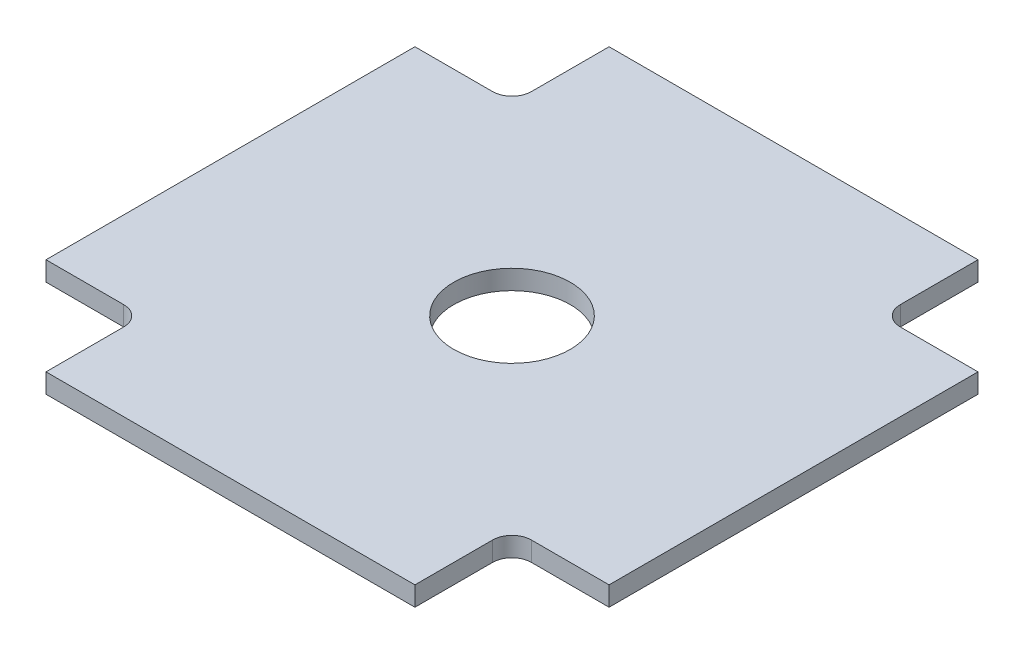
ISO-10303-21;
HEADER;
FILE_DESCRIPTION(('STEP AP214'),'2;1');
FILE_NAME('part.step','',(''),(''),'','','');
FILE_SCHEMA(('AUTOMOTIVE_DESIGN { 1 0 10303 214 1 1 1 1 }'));
ENDSEC;
DATA;
#1=APPLICATION_CONTEXT('core data for automotive mechanical design processes');
#2=APPLICATION_PROTOCOL_DEFINITION('international standard','automotive_design',2000,#1);
#3=PRODUCT_CONTEXT('',#1,'mechanical');
#4=PRODUCT('Part','Part','',(#3));
#5=PRODUCT_RELATED_PRODUCT_CATEGORY('part','',(#4));
#6=PRODUCT_DEFINITION_FORMATION('','',#4);
#7=PRODUCT_DEFINITION_CONTEXT('part definition',#1,'design');
#8=PRODUCT_DEFINITION('design','',#6,#7);
#9=PRODUCT_DEFINITION_SHAPE('','',#8);
#10=(LENGTH_UNIT() NAMED_UNIT(*) SI_UNIT(.MILLI.,.METRE.));
#11=(NAMED_UNIT(*) PLANE_ANGLE_UNIT() SI_UNIT($,.RADIAN.));
#12=(NAMED_UNIT(*) SI_UNIT($,.STERADIAN.) SOLID_ANGLE_UNIT());
#13=UNCERTAINTY_MEASURE_WITH_UNIT(LENGTH_MEASURE(1.E-05),#10,'distance_accuracy_value','');
#14=(GEOMETRIC_REPRESENTATION_CONTEXT(3) GLOBAL_UNCERTAINTY_ASSIGNED_CONTEXT((#13)) GLOBAL_UNIT_ASSIGNED_CONTEXT((#10,
#11,#12)) REPRESENTATION_CONTEXT('',''));
#15=CARTESIAN_POINT('',(0.,0.,0.));
#16=DIRECTION('',(0.,0.,1.));
#17=DIRECTION('',(1.,0.,0.));
#18=AXIS2_PLACEMENT_3D('',#15,#16,#17);
#19=CARTESIAN_POINT('',(0.,1.,0.));
#20=DIRECTION('',(0.,-1.,0.));
#21=DIRECTION('',(0.,0.,-1.));
#22=AXIS2_PLACEMENT_3D('',#19,#20,#21);
#23=PLANE('',#22);
#24=DIRECTION('',(0.,0.,1.));
#25=VECTOR('',#24,1.);
#26=CARTESIAN_POINT('',(0.,1.,-24.));
#27=LINE('',#26,#25);
#28=CARTESIAN_POINT('',(0.,1.,-24.));
#29=VERTEX_POINT('',#28);
#30=CARTESIAN_POINT('',(1.66533453693773E-13,1.,-5.00000000000015));
#31=VERTEX_POINT('',#30);
#32=EDGE_CURVE('E171',#29,#31,#27,.T.);
#33=ORIENTED_EDGE('',*,*,#32,.T.);
#34=DIRECTION('',(1.,0.,0.));
#35=VECTOR('',#34,1.);
#36=CARTESIAN_POINT('',(5.00000000000017,1.,-5.0000000000001));
#37=LINE('',#36,#35);
#38=CARTESIAN_POINT('',(4.00000000000019,1.,-5.00000000000011));
#39=VERTEX_POINT('',#38);
#40=EDGE_CURVE('E161',#31,#39,#37,.T.);
#41=ORIENTED_EDGE('',*,*,#40,.T.);
#42=CARTESIAN_POINT('',(4.00000000000018,1.,-4.00000000000011));
#43=DIRECTION('',(0.,-1.,0.));
#44=DIRECTION('',(0.,0.,-1.));
#45=AXIS2_PLACEMENT_3D('',#42,#43,#44);
#46=CIRCLE('',#45,1.);
#47=CARTESIAN_POINT('',(5.00000000000018,1.,-4.00000000000012));
#48=VERTEX_POINT('',#47);
#49=EDGE_CURVE('E11',#39,#48,#46,.T.);
#50=ORIENTED_EDGE('',*,*,#49,.T.);
#51=DIRECTION('',(0.,0.,1.));
#52=VECTOR('',#51,1.);
#53=CARTESIAN_POINT('',(5.00000000000023,1.,-4.1365962923348E-13));
#54=LINE('',#53,#52);
#55=CARTESIAN_POINT('',(5.00000000000023,1.,-4.1365962923348E-13));
#56=VERTEX_POINT('',#55);
#57=EDGE_CURVE('E170',#48,#56,#54,.T.);
#58=ORIENTED_EDGE('',*,*,#57,.T.);
#59=DIRECTION('',(1.,0.,0.));
#60=VECTOR('',#59,1.);
#61=CARTESIAN_POINT('',(5.00000000000023,1.,-4.1365962923348E-13));
#62=LINE('',#61,#60);
#63=CARTESIAN_POINT('',(24.0000000000002,1.,-1.97758476261356E-13));
#64=VERTEX_POINT('',#63);
#65=EDGE_CURVE('E356',#56,#64,#62,.T.);
#66=ORIENTED_EDGE('',*,*,#65,.T.);
#67=DIRECTION('',(0.,0.,-1.));
#68=VECTOR('',#67,1.);
#69=CARTESIAN_POINT('',(24.0000000000002,1.,-5.0000000000002));
#70=LINE('',#69,#68);
#71=CARTESIAN_POINT('',(24.0000000000002,1.,-4.0000000000002));
#72=VERTEX_POINT('',#71);
#73=EDGE_CURVE('E301',#64,#72,#70,.T.);
#74=ORIENTED_EDGE('',*,*,#73,.T.);
#75=CARTESIAN_POINT('',(25.0000000000002,1.,-4.00000000000019));
#76=DIRECTION('',(0.,-1.,0.));
#77=DIRECTION('',(0.,0.,-1.));
#78=AXIS2_PLACEMENT_3D('',#75,#76,#77);
#79=CIRCLE('',#78,1.);
#80=CARTESIAN_POINT('',(25.0000000000002,1.,-5.00000000000019));
#81=VERTEX_POINT('',#80);
#82=EDGE_CURVE('E225',#72,#81,#79,.T.);
#83=ORIENTED_EDGE('',*,*,#82,.T.);
#84=DIRECTION('',(1.,0.,0.));
#85=VECTOR('',#84,1.);
#86=CARTESIAN_POINT('',(29.0000000000002,1.,-5.00000000000016));
#87=LINE('',#86,#85);
#88=CARTESIAN_POINT('',(29.0000000000002,1.,-5.00000000000016));
#89=VERTEX_POINT('',#88);
#90=EDGE_CURVE('E361',#81,#89,#87,.T.);
#91=ORIENTED_EDGE('',*,*,#90,.T.);
#92=DIRECTION('',(0.,0.,-1.));
#93=VECTOR('',#92,1.);
#94=CARTESIAN_POINT('',(29.,1.,-24.0000000000002));
#95=LINE('',#94,#93);
#96=CARTESIAN_POINT('',(29.,1.,-24.0000000000002));
#97=VERTEX_POINT('',#96);
#98=EDGE_CURVE('E367',#89,#97,#95,.T.);
#99=ORIENTED_EDGE('',*,*,#98,.T.);
#100=DIRECTION('',(-1.,0.,0.));
#101=VECTOR('',#100,1.);
#102=CARTESIAN_POINT('',(24.,1.,-24.0000000000002));
#103=LINE('',#102,#101);
#104=CARTESIAN_POINT('',(25.,1.,-24.0000000000002));
#105=VERTEX_POINT('',#104);
#106=EDGE_CURVE('E340',#97,#105,#103,.T.);
#107=ORIENTED_EDGE('',*,*,#106,.T.);
#108=CARTESIAN_POINT('',(25.,1.,-25.0000000000002));
#109=DIRECTION('',(0.,-1.,0.));
#110=DIRECTION('',(0.,0.,-1.));
#111=AXIS2_PLACEMENT_3D('',#108,#109,#110);
#112=CIRCLE('',#111,1.);
#113=CARTESIAN_POINT('',(24.,1.,-25.0000000000002));
#114=VERTEX_POINT('',#113);
#115=EDGE_CURVE('E231',#105,#114,#112,.T.);
#116=ORIENTED_EDGE('',*,*,#115,.T.);
#117=DIRECTION('',(0.,0.,-1.));
#118=VECTOR('',#117,1.);
#119=CARTESIAN_POINT('',(24.0000000000001,1.,-29.0000000000002));
#120=LINE('',#119,#118);
#121=CARTESIAN_POINT('',(24.0000000000001,1.,-29.0000000000002));
#122=VERTEX_POINT('',#121);
#123=EDGE_CURVE('E335',#114,#122,#120,.T.);
#124=ORIENTED_EDGE('',*,*,#123,.T.);
#125=DIRECTION('',(-1.,0.,0.));
#126=VECTOR('',#125,1.);
#127=CARTESIAN_POINT('',(5.,1.,-29.));
#128=LINE('',#127,#126);
#129=CARTESIAN_POINT('',(5.,1.,-29.));
#130=VERTEX_POINT('',#129);
#131=EDGE_CURVE('E333',#122,#130,#128,.T.);
#132=ORIENTED_EDGE('',*,*,#131,.T.);
#133=DIRECTION('',(0.,0.,1.));
#134=VECTOR('',#133,1.);
#135=CARTESIAN_POINT('',(5.,1.,-24.));
#136=LINE('',#135,#134);
#137=CARTESIAN_POINT('',(5.,1.,-25.));
#138=VERTEX_POINT('',#137);
#139=EDGE_CURVE('E243',#130,#138,#136,.T.);
#140=ORIENTED_EDGE('',*,*,#139,.T.);
#141=CARTESIAN_POINT('',(4.,1.,-25.));
#142=DIRECTION('',(0.,-1.,0.));
#143=DIRECTION('',(0.,0.,-1.));
#144=AXIS2_PLACEMENT_3D('',#141,#142,#143);
#145=CIRCLE('',#144,1.);
#146=CARTESIAN_POINT('',(4.,1.,-24.));
#147=VERTEX_POINT('',#146);
#148=EDGE_CURVE('E237',#138,#147,#145,.T.);
#149=ORIENTED_EDGE('',*,*,#148,.T.);
#150=DIRECTION('',(-1.,0.,0.));
#151=VECTOR('',#150,1.);
#152=CARTESIAN_POINT('',(0.,1.,-24.));
#153=LINE('',#152,#151);
#154=EDGE_CURVE('E176',#147,#29,#153,.T.);
#155=ORIENTED_EDGE('',*,*,#154,.T.);
#156=EDGE_LOOP('',(#33,#41,#50,#58,#66,#74,#83,#91,#99,#107,#116,#124,#132,#140,#149,#155));
#157=FACE_BOUND('',#156,.T.);
#158=CARTESIAN_POINT('',(14.5,1.,-14.5));
#159=DIRECTION('',(0.,1.,0.));
#160=DIRECTION('',(0.,0.,1.));
#161=AXIS2_PLACEMENT_3D('',#158,#159,#160);
#162=CIRCLE('',#161,3.);
#163=CARTESIAN_POINT('',(14.5,1.,-11.5));
#164=VERTEX_POINT('',#163);
#165=EDGE_CURVE('E347',#164,#164,#162,.T.);
#166=ORIENTED_EDGE('',*,*,#165,.F.);
#167=EDGE_LOOP('',(#166));
#168=FACE_BOUND('',#167,.T.);
#169=ADVANCED_FACE('F51',(#157,#168),#23,.F.);
#170=CARTESIAN_POINT('',(0.,0.,0.));
#171=DIRECTION('',(0.,-1.,0.));
#172=DIRECTION('',(0.,0.,-1.));
#173=AXIS2_PLACEMENT_3D('',#170,#171,#172);
#174=PLANE('',#173);
#175=DIRECTION('',(0.,0.,1.));
#176=VECTOR('',#175,1.);
#177=CARTESIAN_POINT('',(0.,0.,-24.));
#178=LINE('',#177,#176);
#179=CARTESIAN_POINT('',(0.,0.,-24.));
#180=VERTEX_POINT('',#179);
#181=CARTESIAN_POINT('',(1.66533453693773E-13,0.,-5.00000000000015));
#182=VERTEX_POINT('',#181);
#183=EDGE_CURVE('E185',#180,#182,#178,.T.);
#184=ORIENTED_EDGE('',*,*,#183,.F.);
#185=DIRECTION('',(-1.,0.,0.));
#186=VECTOR('',#185,1.);
#187=CARTESIAN_POINT('',(0.,0.,-24.));
#188=LINE('',#187,#186);
#189=CARTESIAN_POINT('',(4.,0.,-24.));
#190=VERTEX_POINT('',#189);
#191=EDGE_CURVE('E181',#190,#180,#188,.T.);
#192=ORIENTED_EDGE('',*,*,#191,.F.);
#193=CARTESIAN_POINT('',(4.,0.,-25.));
#194=DIRECTION('',(0.,-1.,0.));
#195=DIRECTION('',(0.,0.,-1.));
#196=AXIS2_PLACEMENT_3D('',#193,#194,#195);
#197=CIRCLE('',#196,1.);
#198=CARTESIAN_POINT('',(5.,0.,-25.));
#199=VERTEX_POINT('',#198);
#200=EDGE_CURVE('E234',#190,#199,#197,.F.);
#201=ORIENTED_EDGE('',*,*,#200,.T.);
#202=DIRECTION('',(0.,0.,1.));
#203=VECTOR('',#202,1.);
#204=CARTESIAN_POINT('',(5.,0.,-24.));
#205=LINE('',#204,#203);
#206=CARTESIAN_POINT('',(5.,0.,-29.));
#207=VERTEX_POINT('',#206);
#208=EDGE_CURVE('E259',#207,#199,#205,.T.);
#209=ORIENTED_EDGE('',*,*,#208,.F.);
#210=DIRECTION('',(-1.,0.,0.));
#211=VECTOR('',#210,1.);
#212=CARTESIAN_POINT('',(5.,0.,-29.));
#213=LINE('',#212,#211);
#214=CARTESIAN_POINT('',(24.0000000000001,0.,-29.0000000000002));
#215=VERTEX_POINT('',#214);
#216=EDGE_CURVE('E266',#215,#207,#213,.T.);
#217=ORIENTED_EDGE('',*,*,#216,.F.);
#218=DIRECTION('',(0.,0.,-1.));
#219=VECTOR('',#218,1.);
#220=CARTESIAN_POINT('',(24.0000000000001,0.,-29.0000000000002));
#221=LINE('',#220,#219);
#222=CARTESIAN_POINT('',(24.,0.,-25.0000000000002));
#223=VERTEX_POINT('',#222);
#224=EDGE_CURVE('E271',#223,#215,#221,.T.);
#225=ORIENTED_EDGE('',*,*,#224,.F.);
#226=CARTESIAN_POINT('',(25.,0.,-25.0000000000002));
#227=DIRECTION('',(0.,-1.,0.));
#228=DIRECTION('',(0.,0.,-1.));
#229=AXIS2_PLACEMENT_3D('',#226,#227,#228);
#230=CIRCLE('',#229,1.);
#231=CARTESIAN_POINT('',(25.,0.,-24.0000000000002));
#232=VERTEX_POINT('',#231);
#233=EDGE_CURVE('E228',#223,#232,#230,.F.);
#234=ORIENTED_EDGE('',*,*,#233,.T.);
#235=DIRECTION('',(-1.,0.,0.));
#236=VECTOR('',#235,1.);
#237=CARTESIAN_POINT('',(24.,0.,-24.0000000000002));
#238=LINE('',#237,#236);
#239=CARTESIAN_POINT('',(29.,0.,-24.0000000000002));
#240=VERTEX_POINT('',#239);
#241=EDGE_CURVE('E320',#240,#232,#238,.T.);
#242=ORIENTED_EDGE('',*,*,#241,.F.);
#243=DIRECTION('',(0.,0.,-1.));
#244=VECTOR('',#243,1.);
#245=CARTESIAN_POINT('',(29.,0.,-24.0000000000002));
#246=LINE('',#245,#244);
#247=CARTESIAN_POINT('',(29.0000000000002,0.,-5.00000000000016));
#248=VERTEX_POINT('',#247);
#249=EDGE_CURVE('E312',#248,#240,#246,.T.);
#250=ORIENTED_EDGE('',*,*,#249,.F.);
#251=DIRECTION('',(1.,0.,0.));
#252=VECTOR('',#251,1.);
#253=CARTESIAN_POINT('',(29.0000000000002,0.,-5.00000000000016));
#254=LINE('',#253,#252);
#255=CARTESIAN_POINT('',(25.0000000000002,0.,-5.00000000000019));
#256=VERTEX_POINT('',#255);
#257=EDGE_CURVE('E308',#256,#248,#254,.T.);
#258=ORIENTED_EDGE('',*,*,#257,.F.);
#259=CARTESIAN_POINT('',(25.0000000000002,0.,-4.00000000000019));
#260=DIRECTION('',(0.,-1.,0.));
#261=DIRECTION('',(0.,0.,-1.));
#262=AXIS2_PLACEMENT_3D('',#259,#260,#261);
#263=CIRCLE('',#262,1.);
#264=CARTESIAN_POINT('',(24.0000000000002,0.,-4.0000000000002));
#265=VERTEX_POINT('',#264);
#266=EDGE_CURVE('E222',#256,#265,#263,.F.);
#267=ORIENTED_EDGE('',*,*,#266,.T.);
#268=DIRECTION('',(0.,0.,-1.));
#269=VECTOR('',#268,1.);
#270=CARTESIAN_POINT('',(24.0000000000002,0.,-5.0000000000002));
#271=LINE('',#270,#269);
#272=CARTESIAN_POINT('',(24.0000000000002,0.,-1.97758476261356E-13));
#273=VERTEX_POINT('',#272);
#274=EDGE_CURVE('E298',#273,#265,#271,.T.);
#275=ORIENTED_EDGE('',*,*,#274,.F.);
#276=DIRECTION('',(1.,0.,0.));
#277=VECTOR('',#276,1.);
#278=CARTESIAN_POINT('',(5.00000000000023,0.,-4.1365962923348E-13));
#279=LINE('',#278,#277);
#280=CARTESIAN_POINT('',(5.00000000000023,0.,-4.1365962923348E-13));
#281=VERTEX_POINT('',#280);
#282=EDGE_CURVE('E305',#281,#273,#279,.T.);
#283=ORIENTED_EDGE('',*,*,#282,.F.);
#284=DIRECTION('',(0.,0.,1.));
#285=VECTOR('',#284,1.);
#286=CARTESIAN_POINT('',(5.00000000000023,0.,-4.1365962923348E-13));
#287=LINE('',#286,#285);
#288=CARTESIAN_POINT('',(5.00000000000018,0.,-4.00000000000012));
#289=VERTEX_POINT('',#288);
#290=EDGE_CURVE('E314',#289,#281,#287,.T.);
#291=ORIENTED_EDGE('',*,*,#290,.F.);
#292=CARTESIAN_POINT('',(4.00000000000018,0.,-4.00000000000011));
#293=DIRECTION('',(0.,-1.,0.));
#294=DIRECTION('',(0.,0.,-1.));
#295=AXIS2_PLACEMENT_3D('',#292,#293,#294);
#296=CIRCLE('',#295,1.);
#297=CARTESIAN_POINT('',(4.00000000000019,0.,-5.00000000000011));
#298=VERTEX_POINT('',#297);
#299=EDGE_CURVE('E60',#289,#298,#296,.F.);
#300=ORIENTED_EDGE('',*,*,#299,.T.);
#301=DIRECTION('',(1.,0.,0.));
#302=VECTOR('',#301,1.);
#303=CARTESIAN_POINT('',(5.00000000000017,0.,-5.0000000000001));
#304=LINE('',#303,#302);
#305=EDGE_CURVE('E346',#182,#298,#304,.T.);
#306=ORIENTED_EDGE('',*,*,#305,.F.);
#307=EDGE_LOOP('',(#184,#192,#201,#209,#217,#225,#234,#242,#250,#258,#267,#275,#283,#291,#300,#306));
#308=FACE_BOUND('',#307,.T.);
#309=CARTESIAN_POINT('',(14.5,0.,-14.5));
#310=DIRECTION('',(0.,1.,0.));
#311=DIRECTION('',(0.,0.,1.));
#312=AXIS2_PLACEMENT_3D('',#309,#310,#311);
#313=CIRCLE('',#312,3.);
#314=CARTESIAN_POINT('',(14.5,0.,-11.5));
#315=VERTEX_POINT('',#314);
#316=EDGE_CURVE('E664',#315,#315,#313,.T.);
#317=ORIENTED_EDGE('',*,*,#316,.T.);
#318=EDGE_LOOP('',(#317));
#319=FACE_BOUND('',#318,.T.);
#320=ADVANCED_FACE('F256',(#308,#319),#174,.T.);
#321=CARTESIAN_POINT('',(0.,1.,-24.));
#322=DIRECTION('',(1.,0.,0.));
#323=DIRECTION('',(0.,0.,-1.));
#324=AXIS2_PLACEMENT_3D('',#321,#322,#323);
#325=PLANE('',#324);
#326=ORIENTED_EDGE('',*,*,#183,.T.);
#327=DIRECTION('',(0.,-1.,0.));
#328=VECTOR('',#327,1.);
#329=CARTESIAN_POINT('',(1.66533453693773E-13,1.,-5.00000000000015));
#330=LINE('',#329,#328);
#331=EDGE_CURVE('E165',#31,#182,#330,.T.);
#332=ORIENTED_EDGE('',*,*,#331,.F.);
#333=ORIENTED_EDGE('',*,*,#32,.F.);
#334=DIRECTION('',(0.,-1.,0.));
#335=VECTOR('',#334,1.);
#336=CARTESIAN_POINT('',(0.,1.,-24.));
#337=LINE('',#336,#335);
#338=EDGE_CURVE('E250',#29,#180,#337,.T.);
#339=ORIENTED_EDGE('',*,*,#338,.T.);
#340=EDGE_LOOP('',(#326,#332,#333,#339));
#341=FACE_BOUND('',#340,.T.);
#342=ADVANCED_FACE('F183',(#341),#325,.F.);
#343=CARTESIAN_POINT('',(5.00000000000017,1.,-5.0000000000001));
#344=DIRECTION('',(0.,0.,-1.));
#345=DIRECTION('',(-1.,0.,0.));
#346=AXIS2_PLACEMENT_3D('',#343,#344,#345);
#347=PLANE('',#346);
#348=ORIENTED_EDGE('',*,*,#305,.T.);
#349=DIRECTION('',(0.,-1.,0.));
#350=VECTOR('',#349,1.);
#351=CARTESIAN_POINT('',(4.00000000000019,1.,-5.00000000000011));
#352=LINE('',#351,#350);
#353=EDGE_CURVE('E67',#298,#39,#352,.F.);
#354=ORIENTED_EDGE('',*,*,#353,.T.);
#355=ORIENTED_EDGE('',*,*,#40,.F.);
#356=ORIENTED_EDGE('',*,*,#331,.T.);
#357=EDGE_LOOP('',(#348,#354,#355,#356));
#358=FACE_BOUND('',#357,.T.);
#359=ADVANCED_FACE('F163',(#358),#347,.F.);
#360=CARTESIAN_POINT('',(5.00000000000023,1.,-4.1365962923348E-13));
#361=DIRECTION('',(1.,0.,0.));
#362=DIRECTION('',(0.,0.,-1.));
#363=AXIS2_PLACEMENT_3D('',#360,#361,#362);
#364=PLANE('',#363);
#365=ORIENTED_EDGE('',*,*,#57,.F.);
#366=DIRECTION('',(0.,-1.,0.));
#367=VECTOR('',#366,1.);
#368=CARTESIAN_POINT('',(5.00000000000018,0.,-4.00000000000012));
#369=LINE('',#368,#367);
#370=EDGE_CURVE('E216',#48,#289,#369,.T.);
#371=ORIENTED_EDGE('',*,*,#370,.T.);
#372=ORIENTED_EDGE('',*,*,#290,.T.);
#373=DIRECTION('',(0.,-1.,0.));
#374=VECTOR('',#373,1.);
#375=CARTESIAN_POINT('',(5.00000000000023,1.,-4.1365962923348E-13));
#376=LINE('',#375,#374);
#377=EDGE_CURVE('E188',#56,#281,#376,.T.);
#378=ORIENTED_EDGE('',*,*,#377,.F.);
#379=EDGE_LOOP('',(#365,#371,#372,#378));
#380=FACE_BOUND('',#379,.T.);
#381=ADVANCED_FACE('F353',(#380),#364,.F.);
#382=CARTESIAN_POINT('',(5.00000000000023,1.,-4.1365962923348E-13));
#383=DIRECTION('',(0.,0.,-1.));
#384=DIRECTION('',(-1.,0.,0.));
#385=AXIS2_PLACEMENT_3D('',#382,#383,#384);
#386=PLANE('',#385);
#387=ORIENTED_EDGE('',*,*,#282,.T.);
#388=DIRECTION('',(0.,-1.,0.));
#389=VECTOR('',#388,1.);
#390=CARTESIAN_POINT('',(24.0000000000002,1.,-1.97758476261356E-13));
#391=LINE('',#390,#389);
#392=EDGE_CURVE('E196',#64,#273,#391,.T.);
#393=ORIENTED_EDGE('',*,*,#392,.F.);
#394=ORIENTED_EDGE('',*,*,#65,.F.);
#395=ORIENTED_EDGE('',*,*,#377,.T.);
#396=EDGE_LOOP('',(#387,#393,#394,#395));
#397=FACE_BOUND('',#396,.T.);
#398=ADVANCED_FACE('F355',(#397),#386,.F.);
#399=CARTESIAN_POINT('',(24.0000000000002,1.,-5.0000000000002));
#400=DIRECTION('',(-1.,0.,0.));
#401=DIRECTION('',(0.,0.,1.));
#402=AXIS2_PLACEMENT_3D('',#399,#400,#401);
#403=PLANE('',#402);
#404=ORIENTED_EDGE('',*,*,#274,.T.);
#405=DIRECTION('',(0.,-1.,0.));
#406=VECTOR('',#405,1.);
#407=CARTESIAN_POINT('',(24.0000000000002,1.,-4.0000000000002));
#408=LINE('',#407,#406);
#409=EDGE_CURVE('E193',#265,#72,#408,.F.);
#410=ORIENTED_EDGE('',*,*,#409,.T.);
#411=ORIENTED_EDGE('',*,*,#73,.F.);
#412=ORIENTED_EDGE('',*,*,#392,.T.);
#413=EDGE_LOOP('',(#404,#410,#411,#412));
#414=FACE_BOUND('',#413,.T.);
#415=ADVANCED_FACE('F297',(#414),#403,.F.);
#416=CARTESIAN_POINT('',(29.0000000000002,1.,-5.00000000000016));
#417=DIRECTION('',(0.,0.,-1.));
#418=DIRECTION('',(-1.,0.,0.));
#419=AXIS2_PLACEMENT_3D('',#416,#417,#418);
#420=PLANE('',#419);
#421=ORIENTED_EDGE('',*,*,#90,.F.);
#422=DIRECTION('',(0.,-1.,0.));
#423=VECTOR('',#422,1.);
#424=CARTESIAN_POINT('',(25.0000000000002,0.,-5.00000000000019));
#425=LINE('',#424,#423);
#426=EDGE_CURVE('E187',#81,#256,#425,.T.);
#427=ORIENTED_EDGE('',*,*,#426,.T.);
#428=ORIENTED_EDGE('',*,*,#257,.T.);
#429=DIRECTION('',(0.,-1.,0.));
#430=VECTOR('',#429,1.);
#431=CARTESIAN_POINT('',(29.0000000000002,1.,-5.00000000000016));
#432=LINE('',#431,#430);
#433=EDGE_CURVE('E287',#89,#248,#432,.T.);
#434=ORIENTED_EDGE('',*,*,#433,.F.);
#435=EDGE_LOOP('',(#421,#427,#428,#434));
#436=FACE_BOUND('',#435,.T.);
#437=ADVANCED_FACE('F387',(#436),#420,.F.);
#438=CARTESIAN_POINT('',(29.,1.,-24.0000000000002));
#439=DIRECTION('',(-1.,0.,0.));
#440=DIRECTION('',(0.,0.,1.));
#441=AXIS2_PLACEMENT_3D('',#438,#439,#440);
#442=PLANE('',#441);
#443=ORIENTED_EDGE('',*,*,#249,.T.);
#444=DIRECTION('',(0.,-1.,0.));
#445=VECTOR('',#444,1.);
#446=CARTESIAN_POINT('',(29.,1.,-24.0000000000002));
#447=LINE('',#446,#445);
#448=EDGE_CURVE('E283',#97,#240,#447,.T.);
#449=ORIENTED_EDGE('',*,*,#448,.F.);
#450=ORIENTED_EDGE('',*,*,#98,.F.);
#451=ORIENTED_EDGE('',*,*,#433,.T.);
#452=EDGE_LOOP('',(#443,#449,#450,#451));
#453=FACE_BOUND('',#452,.T.);
#454=ADVANCED_FACE('F383',(#453),#442,.F.);
#455=CARTESIAN_POINT('',(24.,1.,-24.0000000000002));
#456=DIRECTION('',(0.,0.,1.));
#457=DIRECTION('',(1.,0.,0.));
#458=AXIS2_PLACEMENT_3D('',#455,#456,#457);
#459=PLANE('',#458);
#460=ORIENTED_EDGE('',*,*,#241,.T.);
#461=DIRECTION('',(0.,-1.,0.));
#462=VECTOR('',#461,1.);
#463=CARTESIAN_POINT('',(25.,1.,-24.0000000000002));
#464=LINE('',#463,#462);
#465=EDGE_CURVE('E206',#232,#105,#464,.F.);
#466=ORIENTED_EDGE('',*,*,#465,.T.);
#467=ORIENTED_EDGE('',*,*,#106,.F.);
#468=ORIENTED_EDGE('',*,*,#448,.T.);
#469=EDGE_LOOP('',(#460,#466,#467,#468));
#470=FACE_BOUND('',#469,.T.);
#471=ADVANCED_FACE('F381',(#470),#459,.F.);
#472=CARTESIAN_POINT('',(24.0000000000001,1.,-29.0000000000002));
#473=DIRECTION('',(-1.,0.,0.));
#474=DIRECTION('',(0.,0.,1.));
#475=AXIS2_PLACEMENT_3D('',#472,#473,#474);
#476=PLANE('',#475);
#477=ORIENTED_EDGE('',*,*,#123,.F.);
#478=DIRECTION('',(0.,-1.,0.));
#479=VECTOR('',#478,1.);
#480=CARTESIAN_POINT('',(24.,0.,-25.0000000000002));
#481=LINE('',#480,#479);
#482=EDGE_CURVE('E202',#114,#223,#481,.T.);
#483=ORIENTED_EDGE('',*,*,#482,.T.);
#484=ORIENTED_EDGE('',*,*,#224,.T.);
#485=DIRECTION('',(0.,-1.,0.));
#486=VECTOR('',#485,1.);
#487=CARTESIAN_POINT('',(24.0000000000001,1.,-29.0000000000002));
#488=LINE('',#487,#486);
#489=EDGE_CURVE('E279',#122,#215,#488,.T.);
#490=ORIENTED_EDGE('',*,*,#489,.F.);
#491=EDGE_LOOP('',(#477,#483,#484,#490));
#492=FACE_BOUND('',#491,.T.);
#493=ADVANCED_FACE('F328',(#492),#476,.F.);
#494=CARTESIAN_POINT('',(5.,1.,-29.));
#495=DIRECTION('',(0.,0.,1.));
#496=DIRECTION('',(1.,0.,0.));
#497=AXIS2_PLACEMENT_3D('',#494,#495,#496);
#498=PLANE('',#497);
#499=ORIENTED_EDGE('',*,*,#216,.T.);
#500=DIRECTION('',(0.,-1.,0.));
#501=VECTOR('',#500,1.);
#502=CARTESIAN_POINT('',(5.,1.,-29.));
#503=LINE('',#502,#501);
#504=EDGE_CURVE('E264',#130,#207,#503,.T.);
#505=ORIENTED_EDGE('',*,*,#504,.F.);
#506=ORIENTED_EDGE('',*,*,#131,.F.);
#507=ORIENTED_EDGE('',*,*,#489,.T.);
#508=EDGE_LOOP('',(#499,#505,#506,#507));
#509=FACE_BOUND('',#508,.T.);
#510=ADVANCED_FACE('F332',(#509),#498,.F.);
#511=CARTESIAN_POINT('',(5.,1.,-24.));
#512=DIRECTION('',(1.,0.,0.));
#513=DIRECTION('',(0.,0.,-1.));
#514=AXIS2_PLACEMENT_3D('',#511,#512,#513);
#515=PLANE('',#514);
#516=ORIENTED_EDGE('',*,*,#208,.T.);
#517=DIRECTION('',(0.,-1.,0.));
#518=VECTOR('',#517,1.);
#519=CARTESIAN_POINT('',(5.,1.,-25.));
#520=LINE('',#519,#518);
#521=EDGE_CURVE('E213',#199,#138,#520,.F.);
#522=ORIENTED_EDGE('',*,*,#521,.T.);
#523=ORIENTED_EDGE('',*,*,#139,.F.);
#524=ORIENTED_EDGE('',*,*,#504,.T.);
#525=EDGE_LOOP('',(#516,#522,#523,#524));
#526=FACE_BOUND('',#525,.T.);
#527=ADVANCED_FACE('F262',(#526),#515,.F.);
#528=CARTESIAN_POINT('',(0.,1.,-24.));
#529=DIRECTION('',(0.,0.,1.));
#530=DIRECTION('',(1.,0.,0.));
#531=AXIS2_PLACEMENT_3D('',#528,#529,#530);
#532=PLANE('',#531);
#533=ORIENTED_EDGE('',*,*,#154,.F.);
#534=DIRECTION('',(0.,-1.,0.));
#535=VECTOR('',#534,1.);
#536=CARTESIAN_POINT('',(4.,0.,-24.));
#537=LINE('',#536,#535);
#538=EDGE_CURVE('E209',#147,#190,#537,.T.);
#539=ORIENTED_EDGE('',*,*,#538,.T.);
#540=ORIENTED_EDGE('',*,*,#191,.T.);
#541=ORIENTED_EDGE('',*,*,#338,.F.);
#542=EDGE_LOOP('',(#533,#539,#540,#541));
#543=FACE_BOUND('',#542,.T.);
#544=ADVANCED_FACE('F248',(#543),#532,.F.);
#545=CARTESIAN_POINT('',(14.5,1.,-14.5));
#546=DIRECTION('',(0.,-1.,0.));
#547=DIRECTION('',(0.,0.,-1.));
#548=AXIS2_PLACEMENT_3D('',#545,#546,#547);
#549=CYLINDRICAL_SURFACE('',#548,3.);
#550=ORIENTED_EDGE('',*,*,#165,.T.);
#551=EDGE_LOOP('',(#550));
#552=FACE_BOUND('',#551,.T.);
#553=ORIENTED_EDGE('',*,*,#316,.F.);
#554=EDGE_LOOP('',(#553));
#555=FACE_BOUND('',#554,.T.);
#556=ADVANCED_FACE('F393',(#552,#555),#549,.F.);
#557=CARTESIAN_POINT('',(25.0000000000002,1.,-4.00000000000019));
#558=DIRECTION('',(0.,1.,0.));
#559=DIRECTION('',(0.,0.,1.));
#560=AXIS2_PLACEMENT_3D('',#557,#558,#559);
#561=CYLINDRICAL_SURFACE('',#560,1.);
#562=ORIENTED_EDGE('',*,*,#82,.F.);
#563=ORIENTED_EDGE('',*,*,#409,.F.);
#564=ORIENTED_EDGE('',*,*,#266,.F.);
#565=ORIENTED_EDGE('',*,*,#426,.F.);
#566=EDGE_LOOP('',(#562,#563,#564,#565));
#567=FACE_BOUND('',#566,.T.);
#568=ADVANCED_FACE('F391',(#567),#561,.F.);
#569=CARTESIAN_POINT('',(25.,1.,-25.0000000000002));
#570=DIRECTION('',(0.,1.,0.));
#571=DIRECTION('',(0.,0.,1.));
#572=AXIS2_PLACEMENT_3D('',#569,#570,#571);
#573=CYLINDRICAL_SURFACE('',#572,1.);
#574=ORIENTED_EDGE('',*,*,#115,.F.);
#575=ORIENTED_EDGE('',*,*,#465,.F.);
#576=ORIENTED_EDGE('',*,*,#233,.F.);
#577=ORIENTED_EDGE('',*,*,#482,.F.);
#578=EDGE_LOOP('',(#574,#575,#576,#577));
#579=FACE_BOUND('',#578,.T.);
#580=ADVANCED_FACE('F378',(#579),#573,.F.);
#581=CARTESIAN_POINT('',(4.,1.,-25.));
#582=DIRECTION('',(0.,1.,0.));
#583=DIRECTION('',(0.,0.,1.));
#584=AXIS2_PLACEMENT_3D('',#581,#582,#583);
#585=CYLINDRICAL_SURFACE('',#584,1.);
#586=ORIENTED_EDGE('',*,*,#148,.F.);
#587=ORIENTED_EDGE('',*,*,#521,.F.);
#588=ORIENTED_EDGE('',*,*,#200,.F.);
#589=ORIENTED_EDGE('',*,*,#538,.F.);
#590=EDGE_LOOP('',(#586,#587,#588,#589));
#591=FACE_BOUND('',#590,.T.);
#592=ADVANCED_FACE('F253',(#591),#585,.F.);
#593=CARTESIAN_POINT('',(4.00000000000018,1.,-4.00000000000011));
#594=DIRECTION('',(0.,1.,0.));
#595=DIRECTION('',(0.,0.,1.));
#596=AXIS2_PLACEMENT_3D('',#593,#594,#595);
#597=CYLINDRICAL_SURFACE('',#596,1.);
#598=ORIENTED_EDGE('',*,*,#49,.F.);
#599=ORIENTED_EDGE('',*,*,#353,.F.);
#600=ORIENTED_EDGE('',*,*,#299,.F.);
#601=ORIENTED_EDGE('',*,*,#370,.F.);
#602=EDGE_LOOP('',(#598,#599,#600,#601));
#603=FACE_BOUND('',#602,.T.);
#604=ADVANCED_FACE('F53',(#603),#597,.F.);
#605=CLOSED_SHELL('',(#169,#320,#342,#359,#381,#398,#415,#437,#454,#471,#493,#510,#527,#544,
#556,#568,#580,#592,#604));
#606=MANIFOLD_SOLID_BREP('B2',#605);
#607=ADVANCED_BREP_SHAPE_REPRESENTATION('',(#18,#606),#14);
#608=SHAPE_DEFINITION_REPRESENTATION(#9,#607);
ENDSEC;
END-ISO-10303-21;
